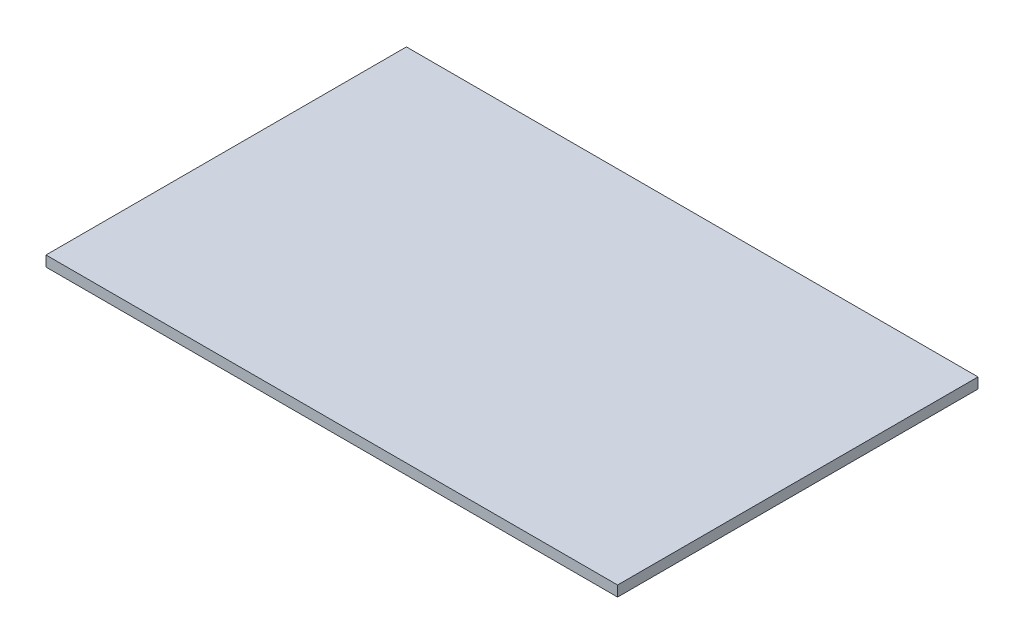
ISO-10303-21;
HEADER;
FILE_DESCRIPTION(('STEP AP214'),'2;1');
FILE_NAME('part.step','',(''),(''),'','','');
FILE_SCHEMA(('AUTOMOTIVE_DESIGN { 1 0 10303 214 1 1 1 1 }'));
ENDSEC;
DATA;
#1=APPLICATION_CONTEXT('core data for automotive mechanical design processes');
#2=APPLICATION_PROTOCOL_DEFINITION('international standard','automotive_design',2000,#1);
#3=PRODUCT_CONTEXT('',#1,'mechanical');
#4=PRODUCT('Part','Part','',(#3));
#5=PRODUCT_RELATED_PRODUCT_CATEGORY('part','',(#4));
#6=PRODUCT_DEFINITION_FORMATION('','',#4);
#7=PRODUCT_DEFINITION_CONTEXT('part definition',#1,'design');
#8=PRODUCT_DEFINITION('design','',#6,#7);
#9=PRODUCT_DEFINITION_SHAPE('','',#8);
#10=(LENGTH_UNIT() NAMED_UNIT(*) SI_UNIT(.MILLI.,.METRE.));
#11=(NAMED_UNIT(*) PLANE_ANGLE_UNIT() SI_UNIT($,.RADIAN.));
#12=(NAMED_UNIT(*) SI_UNIT($,.STERADIAN.) SOLID_ANGLE_UNIT());
#13=UNCERTAINTY_MEASURE_WITH_UNIT(LENGTH_MEASURE(1.E-05),#10,'distance_accuracy_value','');
#14=(GEOMETRIC_REPRESENTATION_CONTEXT(3) GLOBAL_UNCERTAINTY_ASSIGNED_CONTEXT((#13)) GLOBAL_UNIT_ASSIGNED_CONTEXT((#10,
#11,#12)) REPRESENTATION_CONTEXT('',''));
#15=CARTESIAN_POINT('',(0.,0.,0.));
#16=DIRECTION('',(0.,0.,1.));
#17=DIRECTION('',(1.,0.,0.));
#18=AXIS2_PLACEMENT_3D('',#15,#16,#17);
#19=CARTESIAN_POINT('',(27.2,0.5,17.15));
#20=DIRECTION('',(-1.,0.,0.));
#21=DIRECTION('',(0.,0.,1.));
#22=AXIS2_PLACEMENT_3D('',#19,#20,#21);
#23=PLANE('',#22);
#24=DIRECTION('',(0.,0.,-1.));
#25=VECTOR('',#24,1.);
#26=CARTESIAN_POINT('',(27.2,-0.5,17.15));
#27=LINE('',#26,#25);
#28=CARTESIAN_POINT('',(27.2,-0.5,17.15));
#29=VERTEX_POINT('',#28);
#30=CARTESIAN_POINT('',(27.2,-0.5,-17.15));
#31=VERTEX_POINT('',#30);
#32=EDGE_CURVE('E103',#29,#31,#27,.T.);
#33=ORIENTED_EDGE('',*,*,#32,.T.);
#34=DIRECTION('',(0.,-1.,0.));
#35=VECTOR('',#34,1.);
#36=CARTESIAN_POINT('',(27.2,0.5,-17.15));
#37=LINE('',#36,#35);
#38=CARTESIAN_POINT('',(27.2,0.5,-17.15));
#39=VERTEX_POINT('',#38);
#40=EDGE_CURVE('E11',#39,#31,#37,.T.);
#41=ORIENTED_EDGE('',*,*,#40,.F.);
#42=DIRECTION('',(0.,0.,-1.));
#43=VECTOR('',#42,1.);
#44=CARTESIAN_POINT('',(27.2,0.5,17.15));
#45=LINE('',#44,#43);
#46=CARTESIAN_POINT('',(27.2,0.5,17.15));
#47=VERTEX_POINT('',#46);
#48=EDGE_CURVE('E91',#47,#39,#45,.T.);
#49=ORIENTED_EDGE('',*,*,#48,.F.);
#50=DIRECTION('',(0.,-1.,0.));
#51=VECTOR('',#50,1.);
#52=CARTESIAN_POINT('',(27.2,0.5,17.15));
#53=LINE('',#52,#51);
#54=EDGE_CURVE('E99',#47,#29,#53,.T.);
#55=ORIENTED_EDGE('',*,*,#54,.T.);
#56=EDGE_LOOP('',(#33,#41,#49,#55));
#57=FACE_BOUND('',#56,.T.);
#58=ADVANCED_FACE('F40',(#57),#23,.F.);
#59=CARTESIAN_POINT('',(-27.2,0.5,-17.15));
#60=DIRECTION('',(0.,0.,1.));
#61=DIRECTION('',(1.,0.,0.));
#62=AXIS2_PLACEMENT_3D('',#59,#60,#61);
#63=PLANE('',#62);
#64=DIRECTION('',(-1.,0.,0.));
#65=VECTOR('',#64,1.);
#66=CARTESIAN_POINT('',(-27.2,-0.5,-17.15));
#67=LINE('',#66,#65);
#68=CARTESIAN_POINT('',(-27.2,-0.5,-17.15));
#69=VERTEX_POINT('',#68);
#70=EDGE_CURVE('E95',#31,#69,#67,.T.);
#71=ORIENTED_EDGE('',*,*,#70,.T.);
#72=DIRECTION('',(0.,-1.,0.));
#73=VECTOR('',#72,1.);
#74=CARTESIAN_POINT('',(-27.2,0.5,-17.15));
#75=LINE('',#74,#73);
#76=CARTESIAN_POINT('',(-27.2,0.5,-17.15));
#77=VERTEX_POINT('',#76);
#78=EDGE_CURVE('E48',#77,#69,#75,.T.);
#79=ORIENTED_EDGE('',*,*,#78,.F.);
#80=DIRECTION('',(-1.,0.,0.));
#81=VECTOR('',#80,1.);
#82=CARTESIAN_POINT('',(-27.2,0.5,-17.15));
#83=LINE('',#82,#81);
#84=EDGE_CURVE('E86',#39,#77,#83,.T.);
#85=ORIENTED_EDGE('',*,*,#84,.F.);
#86=ORIENTED_EDGE('',*,*,#40,.T.);
#87=EDGE_LOOP('',(#71,#79,#85,#86));
#88=FACE_BOUND('',#87,.T.);
#89=ADVANCED_FACE('F94',(#88),#63,.F.);
#90=CARTESIAN_POINT('',(-27.2,0.5,17.15));
#91=DIRECTION('',(1.,0.,0.));
#92=DIRECTION('',(0.,0.,-1.));
#93=AXIS2_PLACEMENT_3D('',#90,#91,#92);
#94=PLANE('',#93);
#95=DIRECTION('',(0.,0.,1.));
#96=VECTOR('',#95,1.);
#97=CARTESIAN_POINT('',(-27.2,-0.5,17.15));
#98=LINE('',#97,#96);
#99=CARTESIAN_POINT('',(-27.2,-0.5,17.15));
#100=VERTEX_POINT('',#99);
#101=EDGE_CURVE('E73',#69,#100,#98,.T.);
#102=ORIENTED_EDGE('',*,*,#101,.T.);
#103=DIRECTION('',(0.,-1.,0.));
#104=VECTOR('',#103,1.);
#105=CARTESIAN_POINT('',(-27.2,0.5,17.15));
#106=LINE('',#105,#104);
#107=CARTESIAN_POINT('',(-27.2,0.5,17.15));
#108=VERTEX_POINT('',#107);
#109=EDGE_CURVE('E96',#108,#100,#106,.T.);
#110=ORIENTED_EDGE('',*,*,#109,.F.);
#111=DIRECTION('',(0.,0.,1.));
#112=VECTOR('',#111,1.);
#113=CARTESIAN_POINT('',(-27.2,0.5,17.15));
#114=LINE('',#113,#112);
#115=EDGE_CURVE('E89',#77,#108,#114,.T.);
#116=ORIENTED_EDGE('',*,*,#115,.F.);
#117=ORIENTED_EDGE('',*,*,#78,.T.);
#118=EDGE_LOOP('',(#102,#110,#116,#117));
#119=FACE_BOUND('',#118,.T.);
#120=ADVANCED_FACE('F97',(#119),#94,.F.);
#121=CARTESIAN_POINT('',(-27.2,0.5,17.15));
#122=DIRECTION('',(0.,0.,-1.));
#123=DIRECTION('',(-1.,0.,0.));
#124=AXIS2_PLACEMENT_3D('',#121,#122,#123);
#125=PLANE('',#124);
#126=DIRECTION('',(1.,0.,0.));
#127=VECTOR('',#126,1.);
#128=CARTESIAN_POINT('',(-27.2,-0.5,17.15));
#129=LINE('',#128,#127);
#130=EDGE_CURVE('E79',#100,#29,#129,.T.);
#131=ORIENTED_EDGE('',*,*,#130,.T.);
#132=ORIENTED_EDGE('',*,*,#54,.F.);
#133=DIRECTION('',(1.,0.,0.));
#134=VECTOR('',#133,1.);
#135=CARTESIAN_POINT('',(-27.2,0.5,17.15));
#136=LINE('',#135,#134);
#137=EDGE_CURVE('E56',#108,#47,#136,.T.);
#138=ORIENTED_EDGE('',*,*,#137,.F.);
#139=ORIENTED_EDGE('',*,*,#109,.T.);
#140=EDGE_LOOP('',(#131,#132,#138,#139));
#141=FACE_BOUND('',#140,.T.);
#142=ADVANCED_FACE('F110',(#141),#125,.F.);
#143=CARTESIAN_POINT('',(0.,0.5,0.));
#144=DIRECTION('',(0.,-1.,0.));
#145=DIRECTION('',(0.,0.,-1.));
#146=AXIS2_PLACEMENT_3D('',#143,#144,#145);
#147=PLANE('',#146);
#148=ORIENTED_EDGE('',*,*,#48,.T.);
#149=ORIENTED_EDGE('',*,*,#84,.T.);
#150=ORIENTED_EDGE('',*,*,#115,.T.);
#151=ORIENTED_EDGE('',*,*,#137,.T.);
#152=EDGE_LOOP('',(#148,#149,#150,#151));
#153=FACE_BOUND('',#152,.T.);
#154=ADVANCED_FACE('F87',(#153),#147,.F.);
#155=CARTESIAN_POINT('',(0.,-0.5,0.));
#156=DIRECTION('',(0.,-1.,0.));
#157=DIRECTION('',(0.,0.,-1.));
#158=AXIS2_PLACEMENT_3D('',#155,#156,#157);
#159=PLANE('',#158);
#160=ORIENTED_EDGE('',*,*,#32,.F.);
#161=ORIENTED_EDGE('',*,*,#130,.F.);
#162=ORIENTED_EDGE('',*,*,#101,.F.);
#163=ORIENTED_EDGE('',*,*,#70,.F.);
#164=EDGE_LOOP('',(#160,#161,#162,#163));
#165=FACE_BOUND('',#164,.T.);
#166=ADVANCED_FACE('F113',(#165),#159,.T.);
#167=CLOSED_SHELL('',(#58,#89,#120,#142,#154,#166));
#168=MANIFOLD_SOLID_BREP('B2',#167);
#169=ADVANCED_BREP_SHAPE_REPRESENTATION('',(#18,#168),#14);
#170=SHAPE_DEFINITION_REPRESENTATION(#9,#169);
ENDSEC;
END-ISO-10303-21;
